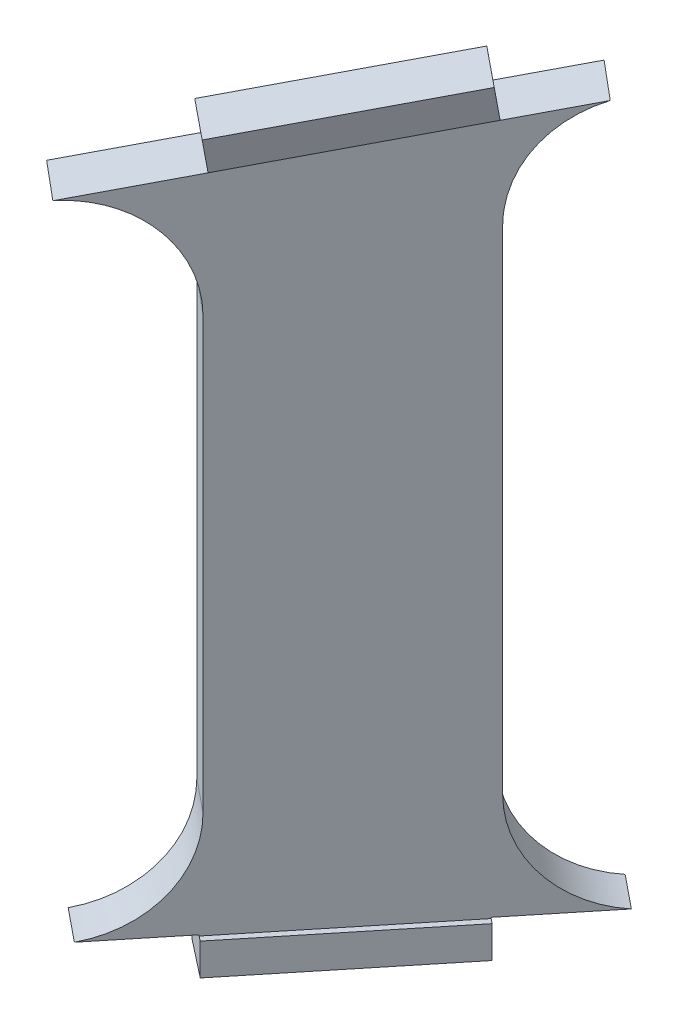
ISO-10303-21;
HEADER;
FILE_DESCRIPTION(('STEP AP214'),'2;1');
FILE_NAME('part.step','',(''),(''),'','','');
FILE_SCHEMA(('AUTOMOTIVE_DESIGN { 1 0 10303 214 1 1 1 1 }'));
ENDSEC;
DATA;
#1=APPLICATION_CONTEXT('core data for automotive mechanical design processes');
#2=APPLICATION_PROTOCOL_DEFINITION('international standard','automotive_design',2000,#1);
#3=PRODUCT_CONTEXT('',#1,'mechanical');
#4=PRODUCT('Part','Part','',(#3));
#5=PRODUCT_RELATED_PRODUCT_CATEGORY('part','',(#4));
#6=PRODUCT_DEFINITION_FORMATION('','',#4);
#7=PRODUCT_DEFINITION_CONTEXT('part definition',#1,'design');
#8=PRODUCT_DEFINITION('design','',#6,#7);
#9=PRODUCT_DEFINITION_SHAPE('','',#8);
#10=(LENGTH_UNIT() NAMED_UNIT(*) SI_UNIT(.MILLI.,.METRE.));
#11=(NAMED_UNIT(*) PLANE_ANGLE_UNIT() SI_UNIT($,.RADIAN.));
#12=(NAMED_UNIT(*) SI_UNIT($,.STERADIAN.) SOLID_ANGLE_UNIT());
#13=UNCERTAINTY_MEASURE_WITH_UNIT(LENGTH_MEASURE(1.E-05),#10,'distance_accuracy_value','');
#14=(GEOMETRIC_REPRESENTATION_CONTEXT(3) GLOBAL_UNCERTAINTY_ASSIGNED_CONTEXT((#13)) GLOBAL_UNIT_ASSIGNED_CONTEXT((#10,
#11,#12)) REPRESENTATION_CONTEXT('',''));
#15=CARTESIAN_POINT('',(0.,0.,0.));
#16=DIRECTION('',(0.,0.,1.));
#17=DIRECTION('',(1.,0.,0.));
#18=AXIS2_PLACEMENT_3D('',#15,#16,#17);
#19=CARTESIAN_POINT('',(87.6889528112121,66.0797360709433,-1.04935465074898));
#20=DIRECTION('',(-0.781529121210514,0.115485382634832,-0.613086746796575));
#21=DIRECTION('',(0.61721643104734,0.,-0.786793414591902));
#22=AXIS2_PLACEMENT_3D('',#19,#20,#21);
#23=PLANE('',#22);
#24=DIRECTION('',(0.623868762401133,0.144670153472484,-0.768022339515152));
#25=VECTOR('',#24,1.);
#26=CARTESIAN_POINT('',(87.6889528112121,69.0278885530628,-0.494019668803317));
#27=LINE('',#26,#25);
#28=CARTESIAN_POINT('',(87.7825331255723,69.0495890760836,-0.609223019730596));
#29=VERTEX_POINT('',#28);
#30=CARTESIAN_POINT('',(100.072747744875,71.8995910994916,-15.7392631081791));
#31=VERTEX_POINT('',#30);
#32=EDGE_CURVE('E175',#29,#31,#27,.T.);
#33=ORIENTED_EDGE('',*,*,#32,.F.);
#34=DIRECTION('',(0.,0.982717494039836,0.185111660648554));
#35=VECTOR('',#34,1.);
#36=CARTESIAN_POINT('',(87.7825331255723,66.1014365939641,-1.16455800167626));
#37=LINE('',#36,#35);
#38=CARTESIAN_POINT('',(87.7825331255723,66.1014365939641,-1.16455800167626));
#39=VERTEX_POINT('',#38);
#40=EDGE_CURVE('E185',#39,#29,#37,.T.);
#41=ORIENTED_EDGE('',*,*,#40,.F.);
#42=DIRECTION('',(0.623868762401133,0.144670153472484,-0.768022339515152));
#43=VECTOR('',#42,1.);
#44=CARTESIAN_POINT('',(87.6889528112121,66.0797360709433,-1.04935465074898));
#45=LINE('',#44,#43);
#46=CARTESIAN_POINT('',(100.072747744875,68.9514386173721,-16.2945980901247));
#47=VERTEX_POINT('',#46);
#48=EDGE_CURVE('E376',#39,#47,#45,.T.);
#49=ORIENTED_EDGE('',*,*,#48,.T.);
#50=DIRECTION('',(0.,0.982717494039836,0.185111660648554));
#51=VECTOR('',#50,1.);
#52=CARTESIAN_POINT('',(100.072747744875,68.9514386173721,-16.2945980901247));
#53=LINE('',#52,#51);
#54=EDGE_CURVE('E187',#47,#31,#53,.T.);
#55=ORIENTED_EDGE('',*,*,#54,.T.);
#56=EDGE_LOOP('',(#33,#41,#49,#55));
#57=FACE_BOUND('',#56,.T.);
#58=ADVANCED_FACE('F34',(#57),#23,.F.);
#59=CARTESIAN_POINT('',(23.2856365374246,56.3073646395534,72.4386164269292));
#60=DIRECTION('',(0.781529121210507,-0.115485382634834,0.613086746796584));
#61=DIRECTION('',(-0.61721643104735,0.,0.786793414591894));
#62=AXIS2_PLACEMENT_3D('',#59,#60,#61);
#63=PLANE('',#62);
#64=DIRECTION('',(-0.623868762401143,-0.144670153472482,0.768022339515144));
#65=VECTOR('',#64,1.);
#66=CARTESIAN_POINT('',(23.2856365374246,55.3246471455136,72.2535047662806));
#67=LINE('',#66,#65);
#68=CARTESIAN_POINT('',(96.8294018920102,72.3788554374026,-18.28357310726));
#69=VERTEX_POINT('',#68);
#70=CARTESIAN_POINT('',(84.5391872727077,69.5288534139947,-3.15353301881178));
#71=VERTEX_POINT('',#70);
#72=EDGE_CURVE('E48',#69,#71,#67,.T.);
#73=ORIENTED_EDGE('',*,*,#72,.F.);
#74=DIRECTION('',(0.,0.982717494039836,0.185111660648554));
#75=VECTOR('',#74,1.);
#76=CARTESIAN_POINT('',(96.8294018920102,69.4307029552831,-18.8389080892057));
#77=LINE('',#76,#75);
#78=CARTESIAN_POINT('',(96.8294018920102,69.4307029552831,-18.8389080892057));
#79=VERTEX_POINT('',#78);
#80=EDGE_CURVE('E194',#79,#69,#77,.T.);
#81=ORIENTED_EDGE('',*,*,#80,.F.);
#82=DIRECTION('',(-0.623868762401143,-0.144670153472503,0.76802233951514));
#83=VECTOR('',#82,1.);
#84=CARTESIAN_POINT('',(45218.3142849364,10532.7405148032,-55566.272071589));
#85=LINE('',#84,#83);
#86=CARTESIAN_POINT('',(84.5391872727077,66.5807009318752,-3.70886800075744));
#87=VERTEX_POINT('',#86);
#88=EDGE_CURVE('E256',#79,#87,#85,.T.);
#89=ORIENTED_EDGE('',*,*,#88,.T.);
#90=DIRECTION('',(0.,0.982717494039836,0.185111660648554));
#91=VECTOR('',#90,1.);
#92=CARTESIAN_POINT('',(84.5391872727077,66.5807009318752,-3.70886800075744));
#93=LINE('',#92,#91);
#94=EDGE_CURVE('E206',#87,#71,#93,.T.);
#95=ORIENTED_EDGE('',*,*,#94,.T.);
#96=EDGE_LOOP('',(#73,#81,#89,#95));
#97=FACE_BOUND('',#96,.T.);
#98=ADVANCED_FACE('F387',(#97),#63,.F.);
#99=CARTESIAN_POINT('',(100.189977113056,68.9341158099769,-16.2026350781053));
#100=DIRECTION('',(-0.623868762401141,-0.144670153472482,0.768022339515146));
#101=DIRECTION('',(-0.776187884580819,0.,-0.630501679482262));
#102=AXIS2_PLACEMENT_3D('',#99,#100,#101);
#103=PLANE('',#102);
#104=DIRECTION('',(-0.781529121210508,0.115485382634833,-0.613086746796583));
#105=VECTOR('',#104,1.);
#106=CARTESIAN_POINT('',(100.189977113056,71.8822682920963,-15.6473000961596));
#107=LINE('',#106,#105);
#108=EDGE_CURVE('E188',#31,#69,#107,.T.);
#109=ORIENTED_EDGE('',*,*,#108,.F.);
#110=ORIENTED_EDGE('',*,*,#54,.F.);
#111=DIRECTION('',(-0.781529121210508,0.115485382634834,-0.613086746796583));
#112=VECTOR('',#111,1.);
#113=CARTESIAN_POINT('',(100.189977113056,68.9341158099769,-16.2026350781053));
#114=LINE('',#113,#112);
#115=CARTESIAN_POINT('',(99.9770303434908,68.9655826337849,-16.3696855931228));
#116=VERTEX_POINT('',#115);
#117=EDGE_CURVE('E289',#47,#116,#114,.T.);
#118=ORIENTED_EDGE('',*,*,#117,.T.);
#119=DIRECTION('',(-0.0912147747353571,0.989479937489512,0.112291220385788));
#120=VECTOR('',#119,1.);
#121=CARTESIAN_POINT('',(-45021.3908201226,489536.690188155,55530.9194033191));
#122=LINE('',#121,#120);
#123=CARTESIAN_POINT('',(99.9862145892339,68.8659537421223,-16.3809919869178));
#124=VERTEX_POINT('',#123);
#125=EDGE_CURVE('E277',#124,#116,#122,.T.);
#126=ORIENTED_EDGE('',*,*,#125,.F.);
#127=DIRECTION('',(0.781529121210507,-0.115485382634835,0.613086746796584));
#128=VECTOR('',#127,1.);
#129=CARTESIAN_POINT('',(96.8294018920102,69.3324312058791,-18.8574192552705));
#130=LINE('',#129,#128);
#131=CARTESIAN_POINT('',(96.8385861377523,69.3310740637012,-18.8502144829965));
#132=VERTEX_POINT('',#131);
#133=EDGE_CURVE('E276',#132,#124,#130,.T.);
#134=ORIENTED_EDGE('',*,*,#133,.F.);
#135=DIRECTION('',(0.0912147747353568,-0.989479937489512,-0.112291220385788));
#136=VECTOR('',#135,1.);
#137=CARTESIAN_POINT('',(104.726730982295,-16.2379698804638,-28.5610251904014));
#138=LINE('',#137,#136);
#139=EDGE_CURVE('E274',#79,#132,#138,.T.);
#140=ORIENTED_EDGE('',*,*,#139,.F.);
#141=ORIENTED_EDGE('',*,*,#80,.T.);
#142=EDGE_LOOP('',(#109,#110,#118,#126,#134,#140,#141));
#143=FACE_BOUND('',#142,.T.);
#144=ADVANCED_FACE('F374',(#143),#103,.F.);
#145=CARTESIAN_POINT('',(84.5391872727077,66.5807009318752,-3.70886800075744));
#146=DIRECTION('',(0.623868762401155,0.14467015347248,-0.768022339515134));
#147=DIRECTION('',(0.776187884580808,0.,0.630501679482276));
#148=AXIS2_PLACEMENT_3D('',#145,#146,#147);
#149=PLANE('',#148);
#150=DIRECTION('',(0.781529121210496,-0.115485382634836,0.613086746796597));
#151=VECTOR('',#150,1.);
#152=CARTESIAN_POINT('',(84.5391872727077,69.5288534139947,-3.15353301881178));
#153=LINE('',#152,#151);
#154=EDGE_CURVE('E11',#71,#29,#153,.T.);
#155=ORIENTED_EDGE('',*,*,#154,.F.);
#156=ORIENTED_EDGE('',*,*,#94,.F.);
#157=DIRECTION('',(-0.0912147747353556,0.989479937489513,0.112291220385787));
#158=VECTOR('',#157,1.);
#159=CARTESIAN_POINT('',(92.4365163629929,-19.0879719038714,-13.4309851019529));
#160=LINE('',#159,#158);
#161=CARTESIAN_POINT('',(84.5483715184498,66.4810720402933,-3.72017439454826));
#162=VERTEX_POINT('',#161);
#163=EDGE_CURVE('E208',#162,#87,#160,.T.);
#164=ORIENTED_EDGE('',*,*,#163,.F.);
#165=DIRECTION('',(-0.781529121210496,0.115485382634836,-0.613086746796597));
#166=VECTOR('',#165,1.);
#167=CARTESIAN_POINT('',(87.7825331255723,66.0031648445602,-1.18306916774111));
#168=LINE('',#167,#166);
#169=CARTESIAN_POINT('',(87.6959999699201,66.015951718793,-1.25095189845959));
#170=VERTEX_POINT('',#169);
#171=EDGE_CURVE('E270',#170,#162,#168,.T.);
#172=ORIENTED_EDGE('',*,*,#171,.F.);
#173=DIRECTION('',(0.0912147747353559,-0.989479937489513,-0.112291220385786));
#174=VECTOR('',#173,1.);
#175=CARTESIAN_POINT('',(-45033.6810347413,489533.840186132,55546.0494434069));
#176=LINE('',#175,#174);
#177=CARTESIAN_POINT('',(87.6868157241857,66.1155806103853,-1.23964550466916));
#178=VERTEX_POINT('',#177);
#179=EDGE_CURVE('E271',#178,#170,#176,.T.);
#180=ORIENTED_EDGE('',*,*,#179,.F.);
#181=DIRECTION('',(0.781529121210496,-0.115485382634836,0.613086746796597));
#182=VECTOR('',#181,1.);
#183=CARTESIAN_POINT('',(84.5391872727077,66.5807009318752,-3.70886800075744));
#184=LINE('',#183,#182);
#185=EDGE_CURVE('E192',#178,#39,#184,.T.);
#186=ORIENTED_EDGE('',*,*,#185,.T.);
#187=ORIENTED_EDGE('',*,*,#40,.T.);
#188=EDGE_LOOP('',(#155,#156,#164,#172,#180,#186,#187));
#189=FACE_BOUND('',#188,.T.);
#190=ADVANCED_FACE('F190',(#189),#149,.F.);
#191=CARTESIAN_POINT('',(87.6897539967065,4.,-0.311520248057614));
#192=DIRECTION('',(0.776187884580825,0.,0.630501679482254));
#193=DIRECTION('',(-0.630501679482254,0.,0.776187884580826));
#194=AXIS2_PLACEMENT_3D('',#191,#192,#193);
#195=PLANE('',#194);
#196=DIRECTION('',(0.,-1.,0.));
#197=VECTOR('',#196,1.);
#198=CARTESIAN_POINT('',(87.7827350313063,3.99999999999999,-0.425985847279171));
#199=LINE('',#198,#197);
#200=CARTESIAN_POINT('',(87.7827350313063,3.99999999999999,-0.425985847279171));
#201=VERTEX_POINT('',#200);
#202=CARTESIAN_POINT('',(87.7827350313063,0.999999999999994,-0.425985847279178));
#203=VERTEX_POINT('',#202);
#204=EDGE_CURVE('E294',#201,#203,#199,.T.);
#205=ORIENTED_EDGE('',*,*,#204,.T.);
#206=DIRECTION('',(0.630501679482254,0.,-0.776187884580826));
#207=VECTOR('',#206,1.);
#208=CARTESIAN_POINT('',(87.6897539967065,0.999999999999987,-0.311520248057612));
#209=LINE('',#208,#207);
#210=CARTESIAN_POINT('',(100.070932441643,0.999999999999994,-15.5535426225011));
#211=VERTEX_POINT('',#210);
#212=EDGE_CURVE('E195',#203,#211,#209,.T.);
#213=ORIENTED_EDGE('',*,*,#212,.T.);
#214=DIRECTION('',(0.,-1.,0.));
#215=VECTOR('',#214,1.);
#216=CARTESIAN_POINT('',(100.070932441643,4.,-15.5535426225011));
#217=LINE('',#216,#215);
#218=CARTESIAN_POINT('',(100.070932441643,4.,-15.5535426225011));
#219=VERTEX_POINT('',#218);
#220=EDGE_CURVE('E290',#219,#211,#217,.T.);
#221=ORIENTED_EDGE('',*,*,#220,.F.);
#222=DIRECTION('',(0.630501679482254,0.,-0.776187884580826));
#223=VECTOR('',#222,1.);
#224=CARTESIAN_POINT('',(87.6897539967065,4.,-0.311520248057614));
#225=LINE('',#224,#223);
#226=EDGE_CURVE('E237',#201,#219,#225,.T.);
#227=ORIENTED_EDGE('',*,*,#226,.F.);
#228=EDGE_LOOP('',(#205,#213,#221,#227));
#229=FACE_BOUND('',#228,.T.);
#230=ADVANCED_FACE('F407',(#229),#195,.T.);
#231=CARTESIAN_POINT('',(72.0356800443528,3.99999999999999,-12.7790901034905));
#232=DIRECTION('',(-0.617216431047363,0.,0.786793414591884));
#233=DIRECTION('',(-0.786793414591884,0.,-0.617216431047363));
#234=AXIS2_PLACEMENT_3D('',#231,#232,#233);
#235=PLANE('',#234);
#236=DIRECTION('',(0.,1.,0.));
#237=VECTOR('',#236,1.);
#238=CARTESIAN_POINT('',(84.1728260475065,4.,-3.25785390573572));
#239=LINE('',#238,#237);
#240=CARTESIAN_POINT('',(84.1728260475065,0.999999999999987,-3.25785390573571));
#241=VERTEX_POINT('',#240);
#242=CARTESIAN_POINT('',(84.1728260475065,4.09999999999998,-3.25785390573572));
#243=VERTEX_POINT('',#242);
#244=EDGE_CURVE('E293',#241,#243,#239,.T.);
#245=ORIENTED_EDGE('',*,*,#244,.F.);
#246=DIRECTION('',(0.786793414591884,0.,0.617216431047363));
#247=VECTOR('',#246,1.);
#248=CARTESIAN_POINT('',(72.0356800443528,0.999999999999994,-12.7790901034905));
#249=LINE('',#248,#247);
#250=EDGE_CURVE('E201',#241,#203,#249,.T.);
#251=ORIENTED_EDGE('',*,*,#250,.T.);
#252=ORIENTED_EDGE('',*,*,#204,.F.);
#253=DIRECTION('',(0.786793414591884,0.,0.617216431047363));
#254=VECTOR('',#253,1.);
#255=CARTESIAN_POINT('',(72.0356800443528,3.99999999999999,-12.7790901034905));
#256=LINE('',#255,#254);
#257=CARTESIAN_POINT('',(87.3204544989858,4.00000000000954,-0.788631409646447));
#258=VERTEX_POINT('',#257);
#259=EDGE_CURVE('E297',#258,#201,#256,.T.);
#260=ORIENTED_EDGE('',*,*,#259,.F.);
#261=DIRECTION('',(0.,-1.,0.));
#262=VECTOR('',#261,1.);
#263=CARTESIAN_POINT('',(87.3204544989857,500000.,-0.788631409646485));
#264=LINE('',#263,#262);
#265=CARTESIAN_POINT('',(87.3204544989858,4.09999999999999,-0.788631409646448));
#266=VERTEX_POINT('',#265);
#267=EDGE_CURVE('E316',#266,#258,#264,.T.);
#268=ORIENTED_EDGE('',*,*,#267,.F.);
#269=DIRECTION('',(0.786793414591884,0.,0.617216431047363));
#270=VECTOR('',#269,1.);
#271=CARTESIAN_POINT('',(84.1728260475065,4.09999999999998,-3.25785390573572));
#272=LINE('',#271,#270);
#273=EDGE_CURVE('E318',#243,#266,#272,.T.);
#274=ORIENTED_EDGE('',*,*,#273,.F.);
#275=EDGE_LOOP('',(#245,#251,#252,#260,#268,#274));
#276=FACE_BOUND('',#275,.T.);
#277=ADVANCED_FACE('F344',(#276),#235,.T.);
#278=CARTESIAN_POINT('',(192.,4.,-136.));
#279=DIRECTION('',(0.776187884580818,0.,0.630501679482264));
#280=DIRECTION('',(-0.630501679482264,0.,0.776187884580818));
#281=AXIS2_PLACEMENT_3D('',#278,#279,#280);
#282=PLANE('',#281);
#283=DIRECTION('',(0.630501679482264,0.,-0.776187884580818));
#284=VECTOR('',#283,1.);
#285=CARTESIAN_POINT('',(192.,0.999999999999987,-136.));
#286=LINE('',#285,#284);
#287=CARTESIAN_POINT('',(96.4610234578431,1.,-18.3854106809575));
#288=VERTEX_POINT('',#287);
#289=EDGE_CURVE('E56',#241,#288,#286,.T.);
#290=ORIENTED_EDGE('',*,*,#289,.F.);
#291=ORIENTED_EDGE('',*,*,#244,.T.);
#292=DIRECTION('',(-0.630501679482264,0.,0.776187884580818));
#293=VECTOR('',#292,1.);
#294=CARTESIAN_POINT('',(192.,4.09999999999999,-136.));
#295=LINE('',#294,#293);
#296=CARTESIAN_POINT('',(78.9636930653886,4.09999999999999,3.15492189084962));
#297=VERTEX_POINT('',#296);
#298=EDGE_CURVE('E310',#243,#297,#295,.T.);
#299=ORIENTED_EDGE('',*,*,#298,.T.);
#300=CARTESIAN_POINT('',(78.0742609927136,14.00000000001,4.24986964663483));
#301=DIRECTION('',(-0.776187884580818,0.,-0.630501679482264));
#302=DIRECTION('',(-0.630501679482264,0.,0.776187884580818));
#303=AXIS2_PLACEMENT_3D('',#300,#301,#302);
#304=CIRCLE('',#303,10.);
#305=CARTESIAN_POINT('',(84.3792777875361,14.00000000001,-3.51200919917349));
#306=VERTEX_POINT('',#305);
#307=EDGE_CURVE('E223',#306,#297,#304,.T.);
#308=ORIENTED_EDGE('',*,*,#307,.F.);
#309=DIRECTION('',(0.,-1.,0.));
#310=VECTOR('',#309,1.);
#311=CARTESIAN_POINT('',(84.379277787536,500000.,-3.51200919917357));
#312=LINE('',#311,#310);
#313=CARTESIAN_POINT('',(84.3792777875361,54.9056720327599,-3.51200919917349));
#314=VERTEX_POINT('',#313);
#315=EDGE_CURVE('E220',#314,#306,#312,.T.);
#316=ORIENTED_EDGE('',*,*,#315,.F.);
#317=CARTESIAN_POINT('',(78.0742609927137,54.9056720327663,4.24986964663483));
#318=DIRECTION('',(-0.776187884580818,0.,-0.630501679482264));
#319=DIRECTION('',(0.,-1.,0.));
#320=AXIS2_PLACEMENT_3D('',#317,#318,#319);
#321=ELLIPSE('',#320,10.0702795953244,10.);
#322=CARTESIAN_POINT('',(78.0576096315716,64.9759165093224,4.27036853696438));
#323=VERTEX_POINT('',#322);
#324=EDGE_CURVE('E224',#323,#314,#321,.T.);
#325=ORIENTED_EDGE('',*,*,#324,.F.);
#326=DIRECTION('',(0.623868762401143,0.144670153472482,-0.768022339515144));
#327=VECTOR('',#326,1.);
#328=CARTESIAN_POINT('',(184.111855155457,89.5690439441649,-126.289189292595));
#329=LINE('',#328,#327);
#330=EDGE_CURVE('E207',#323,#162,#329,.T.);
#331=ORIENTED_EDGE('',*,*,#330,.T.);
#332=ORIENTED_EDGE('',*,*,#163,.T.);
#333=ORIENTED_EDGE('',*,*,#88,.F.);
#334=ORIENTED_EDGE('',*,*,#139,.T.);
#335=CARTESIAN_POINT('',(101.51727017257,70.4160233000778,-24.6099737061431));
#336=VERTEX_POINT('',#335);
#337=EDGE_CURVE('E198',#132,#336,#329,.T.);
#338=ORIENTED_EDGE('',*,*,#337,.T.);
#339=CARTESIAN_POINT('',(103.294328172004,60.7540029787999,-26.7976457365979));
#340=DIRECTION('',(-0.776187884580818,0.,-0.630501679482264));
#341=DIRECTION('',(0.,1.,0.));
#342=AXIS2_PLACEMENT_3D('',#339,#340,#341);
#343=ELLIPSE('',#342,10.0702795953244,10.);
#344=CARTESIAN_POINT('',(96.9893113771814,60.754002978797,-19.0357668907898));
#345=VERTEX_POINT('',#344);
#346=EDGE_CURVE('E251',#345,#336,#343,.T.);
#347=ORIENTED_EDGE('',*,*,#346,.F.);
#348=DIRECTION('',(0.,-1.,0.));
#349=VECTOR('',#348,1.);
#350=CARTESIAN_POINT('',(96.9893113771813,500000.,-19.0357668907899));
#351=LINE('',#350,#349);
#352=CARTESIAN_POINT('',(96.9893113771814,14.00000000001,-19.0357668907898));
#353=VERTEX_POINT('',#352);
#354=EDGE_CURVE('E225',#345,#353,#351,.T.);
#355=ORIENTED_EDGE('',*,*,#354,.T.);
#356=CARTESIAN_POINT('',(103.294328172004,14.00000000001,-26.7976457365979));
#357=DIRECTION('',(-0.776187884580818,0.,-0.630501679482264));
#358=DIRECTION('',(-0.630501679482264,0.,0.776187884580818));
#359=AXIS2_PLACEMENT_3D('',#356,#357,#358);
#360=CIRCLE('',#359,10.);
#361=CARTESIAN_POINT('',(102.404896099329,4.09999999999999,-25.7026979808127));
#362=VERTEX_POINT('',#361);
#363=EDGE_CURVE('E249',#362,#353,#360,.T.);
#364=ORIENTED_EDGE('',*,*,#363,.F.);
#365=CARTESIAN_POINT('',(96.4610234578431,4.09999999999999,-18.3854106809574));
#366=VERTEX_POINT('',#365);
#367=EDGE_CURVE('E314',#362,#366,#295,.T.);
#368=ORIENTED_EDGE('',*,*,#367,.T.);
#369=DIRECTION('',(0.,-1.,0.));
#370=VECTOR('',#369,1.);
#371=CARTESIAN_POINT('',(96.4610234578431,4.,-18.3854106809575));
#372=LINE('',#371,#370);
#373=EDGE_CURVE('E242',#366,#288,#372,.T.);
#374=ORIENTED_EDGE('',*,*,#373,.T.);
#375=EDGE_LOOP('',(#290,#291,#299,#308,#316,#325,#331,#332,#333,#334,#338,#347,#355,#364,#368,#374));
#376=FACE_BOUND('',#375,.T.);
#377=ADVANCED_FACE('F390',(#376),#282,.F.);
#378=CARTESIAN_POINT('',(100.190974962759,4.,-15.4593727742495));
#379=DIRECTION('',(0.617216431047349,0.,-0.786793414591894));
#380=DIRECTION('',(0.786793414591894,0.,0.617216431047349));
#381=AXIS2_PLACEMENT_3D('',#378,#379,#380);
#382=PLANE('',#381);
#383=ORIENTED_EDGE('',*,*,#220,.T.);
#384=DIRECTION('',(-0.786793414591895,0.,-0.617216431047349));
#385=VECTOR('',#384,1.);
#386=CARTESIAN_POINT('',(100.190974962759,0.999999999999994,-15.4593727742495));
#387=LINE('',#386,#385);
#388=EDGE_CURVE('E42',#211,#288,#387,.T.);
#389=ORIENTED_EDGE('',*,*,#388,.T.);
#390=ORIENTED_EDGE('',*,*,#373,.F.);
#391=DIRECTION('',(-0.786793414591895,0.,-0.617216431047348));
#392=VECTOR('',#391,1.);
#393=CARTESIAN_POINT('',(100.070932441643,4.09999999999999,-15.5535426225011));
#394=LINE('',#393,#392);
#395=CARTESIAN_POINT('',(99.6086519093224,4.09999999999999,-15.9161881848682));
#396=VERTEX_POINT('',#395);
#397=EDGE_CURVE('E321',#396,#366,#394,.T.);
#398=ORIENTED_EDGE('',*,*,#397,.F.);
#399=DIRECTION('',(0.,1.,0.));
#400=VECTOR('',#399,1.);
#401=CARTESIAN_POINT('',(99.6086519093223,500000.,-15.9161881848683));
#402=LINE('',#401,#400);
#403=CARTESIAN_POINT('',(99.6086519093224,4.,-15.9161881848682));
#404=VERTEX_POINT('',#403);
#405=EDGE_CURVE('E305',#404,#396,#402,.T.);
#406=ORIENTED_EDGE('',*,*,#405,.F.);
#407=DIRECTION('',(-0.786793414591894,0.,-0.617216431047349));
#408=VECTOR('',#407,1.);
#409=CARTESIAN_POINT('',(100.190974962759,4.,-15.4593727742495));
#410=LINE('',#409,#408);
#411=EDGE_CURVE('E302',#219,#404,#410,.T.);
#412=ORIENTED_EDGE('',*,*,#411,.F.);
#413=EDGE_LOOP('',(#383,#389,#390,#398,#406,#412));
#414=FACE_BOUND('',#413,.T.);
#415=ADVANCED_FACE('F408',(#414),#382,.T.);
#416=CARTESIAN_POINT('',(190.263416524578,47.4467199030883,43.8478221438401));
#417=DIRECTION('',(-0.770770937622428,0.117936927335513,-0.626101463731958));
#418=DIRECTION('',(0.630501679482265,0.,-0.776187884580817));
#419=AXIS2_PLACEMENT_3D('',#416,#417,#418);
#420=CYLINDRICAL_SURFACE('',#419,10.);
#421=DIRECTION('',(-0.770770937622428,0.117936927335513,-0.626101463731958));
#422=VECTOR('',#421,1.);
#423=CARTESIAN_POINT('',(189.364658936674,56.974350035586,46.7489424199586));
#424=LINE('',#423,#422);
#425=CARTESIAN_POINT('',(104.622021710893,69.940960166925,-22.0879669882141));
#426=VERTEX_POINT('',#425);
#427=EDGE_CURVE('E260',#336,#426,#424,.F.);
#428=ORIENTED_EDGE('',*,*,#427,.T.);
#429=CARTESIAN_POINT('',(106.399079710327,60.278939845647,-24.2756390186689));
#430=DIRECTION('',(0.776187884580816,0.,0.630501679482265));
#431=DIRECTION('',(0.,1.,0.));
#432=AXIS2_PLACEMENT_3D('',#429,#430,#431);
#433=ELLIPSE('',#432,10.0702795953244,10.);
#434=CARTESIAN_POINT('',(100.094062915505,60.2789398456594,-16.5137601728608));
#435=VERTEX_POINT('',#434);
#436=EDGE_CURVE('E214',#426,#435,#433,.T.);
#437=ORIENTED_EDGE('',*,*,#436,.T.);
#438=DIRECTION('',(0.770770937622429,-0.117936927335513,0.626101463731958));
#439=VECTOR('',#438,1.);
#440=CARTESIAN_POINT('',(96.1972080903185,60.875204003936,-19.6791967389125));
#441=LINE('',#440,#439);
#442=EDGE_CURVE('E234',#435,#345,#441,.F.);
#443=ORIENTED_EDGE('',*,*,#442,.T.);
#444=ORIENTED_EDGE('',*,*,#346,.T.);
#445=EDGE_LOOP('',(#428,#437,#443,#444));
#446=FACE_BOUND('',#445,.T.);
#447=ADVANCED_FACE('F366',(#446),#420,.F.);
#448=CARTESIAN_POINT('',(99.9943656155856,35.6903819791565,159.740893755476));
#449=DIRECTION('',(0.,0.982717494039836,0.185111660648554));
#450=DIRECTION('',(0.,-0.185111660648554,0.982717494039836));
#451=AXIS2_PLACEMENT_3D('',#448,#449,#450);
#452=PLANE('',#451);
#453=ORIENTED_EDGE('',*,*,#337,.F.);
#454=ORIENTED_EDGE('',*,*,#133,.T.);
#455=DIRECTION('',(-0.623868762401144,-0.144670153472482,0.768022339515143));
#456=VECTOR('',#455,1.);
#457=CARTESIAN_POINT('',(45221.4710976272,10532.175765587,-55563.8141554788));
#458=LINE('',#457,#456);
#459=EDGE_CURVE('E263',#426,#124,#458,.T.);
#460=ORIENTED_EDGE('',*,*,#459,.F.);
#461=ORIENTED_EDGE('',*,*,#427,.F.);
#462=EDGE_LOOP('',(#453,#454,#460,#461));
#463=FACE_BOUND('',#462,.T.);
#464=ADVANCED_FACE('F370',(#463),#452,.T.);
#465=CARTESIAN_POINT('',(99.9943656155856,37.0585128444138,153.017999416653));
#466=DIRECTION('',(0.,0.982717494039836,0.185111660648554));
#467=DIRECTION('',(0.,-0.185111660648554,0.982717494039836));
#468=AXIS2_PLACEMENT_3D('',#465,#466,#467);
#469=PLANE('',#468);
#470=ORIENTED_EDGE('',*,*,#48,.F.);
#471=ORIENTED_EDGE('',*,*,#185,.F.);
#472=DIRECTION('',(-0.623868762401145,-0.144670153472482,0.768022339515143));
#473=VECTOR('',#472,1.);
#474=CARTESIAN_POINT('',(45221.4619133815,10532.2753944785,-55563.802849085));
#475=LINE('',#474,#473);
#476=EDGE_CURVE('E286',#116,#178,#475,.T.);
#477=ORIENTED_EDGE('',*,*,#476,.F.);
#478=ORIENTED_EDGE('',*,*,#117,.F.);
#479=EDGE_LOOP('',(#470,#471,#477,#478));
#480=FACE_BOUND('',#479,.T.);
#481=ADVANCED_FACE('F446',(#480),#469,.F.);
#482=ORIENTED_EDGE('',*,*,#330,.F.);
#483=DIRECTION('',(0.770770937622428,-0.117936927335513,0.626101463731958));
#484=VECTOR('',#483,1.);
#485=CARTESIAN_POINT('',(165.410479871163,51.6099103366276,75.2275845509745));
#486=LINE('',#485,#484);
#487=CARTESIAN_POINT('',(81.1623611698946,64.5008533761696,6.79237525489328));
#488=VERTEX_POINT('',#487);
#489=EDGE_CURVE('E219',#488,#323,#486,.F.);
#490=ORIENTED_EDGE('',*,*,#489,.F.);
#491=EDGE_CURVE('E264',#170,#488,#458,.T.);
#492=ORIENTED_EDGE('',*,*,#491,.F.);
#493=ORIENTED_EDGE('',*,*,#171,.T.);
#494=EDGE_LOOP('',(#482,#490,#492,#493));
#495=FACE_BOUND('',#494,.T.);
#496=ADVANCED_FACE('F395',(#495),#452,.T.);
#497=CARTESIAN_POINT('',(164.511722283259,41.6797340871364,74.4634939462516));
#498=DIRECTION('',(0.770770937622428,-0.117936927335513,0.626101463731958));
#499=DIRECTION('',(-0.630501679482265,0.,0.776187884580817));
#500=AXIS2_PLACEMENT_3D('',#497,#498,#499);
#501=CYLINDRICAL_SURFACE('',#500,10.);
#502=ORIENTED_EDGE('',*,*,#489,.T.);
#503=ORIENTED_EDGE('',*,*,#324,.T.);
#504=DIRECTION('',(-0.770770937622429,0.117936927335513,-0.626101463731958));
#505=VECTOR('',#504,1.);
#506=CARTESIAN_POINT('',(86.4261125079819,54.5924824897905,-1.84935411977785));
#507=LINE('',#506,#505);
#508=CARTESIAN_POINT('',(87.4840293258594,54.4306088996223,-0.990002481244435));
#509=VERTEX_POINT('',#508);
#510=EDGE_CURVE('E229',#314,#509,#507,.F.);
#511=ORIENTED_EDGE('',*,*,#510,.T.);
#512=CARTESIAN_POINT('',(81.1790125310367,54.4306088996135,6.77187636456372));
#513=DIRECTION('',(0.776187884580816,0.,0.630501679482265));
#514=DIRECTION('',(0.,-1.,0.));
#515=AXIS2_PLACEMENT_3D('',#512,#513,#514);
#516=ELLIPSE('',#515,10.0702795953244,10.);
#517=EDGE_CURVE('E245',#509,#488,#516,.T.);
#518=ORIENTED_EDGE('',*,*,#517,.T.);
#519=EDGE_LOOP('',(#502,#503,#511,#518));
#520=FACE_BOUND('',#519,.T.);
#521=ADVANCED_FACE('F400',(#520),#501,.F.);
#522=CARTESIAN_POINT('',(84.379277787536,500000.,-3.51200919917357));
#523=DIRECTION('',(0.630501679482265,0.,-0.776187884580817));
#524=DIRECTION('',(0.776187884580817,0.,0.630501679482265));
#525=AXIS2_PLACEMENT_3D('',#522,#523,#524);
#526=PLANE('',#525);
#527=DIRECTION('',(0.,-1.,0.));
#528=VECTOR('',#527,1.);
#529=CARTESIAN_POINT('',(87.4840293258593,500000.,-0.990002481244524));
#530=LINE('',#529,#528);
#531=CARTESIAN_POINT('',(87.4840293258594,14.00000000001,-0.990002481244433));
#532=VERTEX_POINT('',#531);
#533=EDGE_CURVE('E215',#509,#532,#530,.T.);
#534=ORIENTED_EDGE('',*,*,#533,.F.);
#535=ORIENTED_EDGE('',*,*,#510,.F.);
#536=ORIENTED_EDGE('',*,*,#315,.T.);
#537=DIRECTION('',(-0.776187884580817,0.,-0.630501679482265));
#538=VECTOR('',#537,1.);
#539=CARTESIAN_POINT('',(84.3792777875361,14.00000000001,-3.51200919917349));
#540=LINE('',#539,#538);
#541=EDGE_CURVE('E218',#532,#306,#540,.T.);
#542=ORIENTED_EDGE('',*,*,#541,.F.);
#543=EDGE_LOOP('',(#534,#535,#536,#542));
#544=FACE_BOUND('',#543,.T.);
#545=ADVANCED_FACE('F402',(#544),#526,.F.);
#546=CARTESIAN_POINT('',(96.9893113771813,500000.,-19.0357668907899));
#547=DIRECTION('',(-0.630501679482265,0.,0.776187884580817));
#548=DIRECTION('',(-0.776187884580817,0.,-0.630501679482265));
#549=AXIS2_PLACEMENT_3D('',#546,#547,#548);
#550=PLANE('',#549);
#551=ORIENTED_EDGE('',*,*,#354,.F.);
#552=ORIENTED_EDGE('',*,*,#442,.F.);
#553=DIRECTION('',(0.,-1.,0.));
#554=VECTOR('',#553,1.);
#555=CARTESIAN_POINT('',(100.094062915505,500000.,-16.5137601728608));
#556=LINE('',#555,#554);
#557=CARTESIAN_POINT('',(100.094062915505,14.00000000001,-16.5137601728608));
#558=VERTEX_POINT('',#557);
#559=EDGE_CURVE('E210',#435,#558,#556,.T.);
#560=ORIENTED_EDGE('',*,*,#559,.T.);
#561=DIRECTION('',(0.776187884580817,0.,0.630501679482265));
#562=VECTOR('',#561,1.);
#563=CARTESIAN_POINT('',(96.9893113771814,14.00000000001,-19.0357668907898));
#564=LINE('',#563,#562);
#565=EDGE_CURVE('E228',#353,#558,#564,.T.);
#566=ORIENTED_EDGE('',*,*,#565,.F.);
#567=EDGE_LOOP('',(#551,#552,#560,#566));
#568=FACE_BOUND('',#567,.T.);
#569=ADVANCED_FACE('F363',(#568),#550,.F.);
#570=CARTESIAN_POINT('',(0.,3.99999999999999,52.783119399867));
#571=DIRECTION('',(0.,1.,0.));
#572=DIRECTION('',(0.,0.,1.));
#573=AXIS2_PLACEMENT_3D('',#570,#571,#572);
#574=PLANE('',#573);
#575=ORIENTED_EDGE('',*,*,#226,.T.);
#576=ORIENTED_EDGE('',*,*,#411,.T.);
#577=DIRECTION('',(-0.630501679482266,0.,0.776187884580816));
#578=VECTOR('',#577,1.);
#579=CARTESIAN_POINT('',(100.094062915505,4.,-16.5137601728608));
#580=LINE('',#579,#578);
#581=EDGE_CURVE('E246',#404,#258,#580,.T.);
#582=ORIENTED_EDGE('',*,*,#581,.T.);
#583=ORIENTED_EDGE('',*,*,#259,.T.);
#584=EDGE_LOOP('',(#575,#576,#582,#583));
#585=FACE_BOUND('',#584,.T.);
#586=ADVANCED_FACE('F348',(#585),#574,.T.);
#587=CARTESIAN_POINT('',(103.294328172004,14.00000000001,-26.797645736598));
#588=DIRECTION('',(0.776187884580817,0.,0.630501679482265));
#589=DIRECTION('',(-0.630501679482265,0.,0.776187884580817));
#590=AXIS2_PLACEMENT_3D('',#587,#588,#589);
#591=CYLINDRICAL_SURFACE('',#590,10.);
#592=DIRECTION('',(0.776187884580817,0.,0.630501679482265));
#593=VECTOR('',#592,1.);
#594=CARTESIAN_POINT('',(102.404896099329,4.09999999999999,-25.7026979808128));
#595=LINE('',#594,#593);
#596=CARTESIAN_POINT('',(105.509647637652,4.09999999999999,-23.1806912628837));
#597=VERTEX_POINT('',#596);
#598=EDGE_CURVE('E313',#597,#362,#595,.F.);
#599=ORIENTED_EDGE('',*,*,#598,.T.);
#600=ORIENTED_EDGE('',*,*,#363,.T.);
#601=ORIENTED_EDGE('',*,*,#565,.T.);
#602=CARTESIAN_POINT('',(106.399079710327,14.00000000001,-24.2756390186689));
#603=DIRECTION('',(0.776187884580816,0.,0.630501679482265));
#604=DIRECTION('',(0.630501679482266,0.,-0.776187884580816));
#605=AXIS2_PLACEMENT_3D('',#602,#603,#604);
#606=CIRCLE('',#605,10.);
#607=EDGE_CURVE('E213',#558,#597,#606,.T.);
#608=ORIENTED_EDGE('',*,*,#607,.T.);
#609=EDGE_LOOP('',(#599,#600,#601,#608));
#610=FACE_BOUND('',#609,.T.);
#611=ADVANCED_FACE('F357',(#610),#591,.F.);
#612=CARTESIAN_POINT('',(78.0742609927135,14.00000000001,4.24986964663468));
#613=DIRECTION('',(-0.776187884580817,0.,-0.630501679482265));
#614=DIRECTION('',(0.630501679482265,0.,-0.776187884580817));
#615=AXIS2_PLACEMENT_3D('',#612,#613,#614);
#616=CYLINDRICAL_SURFACE('',#615,10.);
#617=DIRECTION('',(-0.776187884580817,0.,-0.630501679482265));
#618=VECTOR('',#617,1.);
#619=CARTESIAN_POINT('',(78.9636930653884,4.09999999999999,3.15492189084948));
#620=LINE('',#619,#618);
#621=CARTESIAN_POINT('',(82.0684446037117,4.09999999999999,5.67692860877852));
#622=VERTEX_POINT('',#621);
#623=EDGE_CURVE('E306',#297,#622,#620,.F.);
#624=ORIENTED_EDGE('',*,*,#623,.T.);
#625=CARTESIAN_POINT('',(81.1790125310367,14.00000000001,6.77187636456373));
#626=DIRECTION('',(0.776187884580816,0.,0.630501679482265));
#627=DIRECTION('',(0.630501679482266,0.,-0.776187884580816));
#628=AXIS2_PLACEMENT_3D('',#625,#626,#627);
#629=CIRCLE('',#628,10.);
#630=EDGE_CURVE('E243',#622,#532,#629,.T.);
#631=ORIENTED_EDGE('',*,*,#630,.T.);
#632=ORIENTED_EDGE('',*,*,#541,.T.);
#633=ORIENTED_EDGE('',*,*,#307,.T.);
#634=EDGE_LOOP('',(#624,#631,#632,#633));
#635=FACE_BOUND('',#634,.T.);
#636=ADVANCED_FACE('F405',(#635),#616,.F.);
#637=CARTESIAN_POINT('',(100.094062915505,500000.,-16.5137601728608));
#638=DIRECTION('',(-0.776187884580816,0.,-0.630501679482265));
#639=DIRECTION('',(0.630501679482266,0.,-0.776187884580816));
#640=AXIS2_PLACEMENT_3D('',#637,#638,#639);
#641=PLANE('',#640);
#642=DIRECTION('',(0.630501679482266,0.,-0.776187884580816));
#643=VECTOR('',#642,1.);
#644=CARTESIAN_POINT('',(100.094062915505,4.09999999999398,-16.5137601728608));
#645=LINE('',#644,#643);
#646=EDGE_CURVE('E311',#396,#597,#645,.T.);
#647=ORIENTED_EDGE('',*,*,#646,.T.);
#648=ORIENTED_EDGE('',*,*,#607,.F.);
#649=ORIENTED_EDGE('',*,*,#559,.F.);
#650=ORIENTED_EDGE('',*,*,#436,.F.);
#651=ORIENTED_EDGE('',*,*,#459,.T.);
#652=ORIENTED_EDGE('',*,*,#125,.T.);
#653=ORIENTED_EDGE('',*,*,#476,.T.);
#654=ORIENTED_EDGE('',*,*,#179,.T.);
#655=ORIENTED_EDGE('',*,*,#491,.T.);
#656=ORIENTED_EDGE('',*,*,#517,.F.);
#657=ORIENTED_EDGE('',*,*,#533,.T.);
#658=ORIENTED_EDGE('',*,*,#630,.F.);
#659=EDGE_CURVE('E309',#622,#266,#645,.T.);
#660=ORIENTED_EDGE('',*,*,#659,.T.);
#661=ORIENTED_EDGE('',*,*,#267,.T.);
#662=ORIENTED_EDGE('',*,*,#581,.F.);
#663=ORIENTED_EDGE('',*,*,#405,.T.);
#664=EDGE_LOOP('',(#647,#648,#649,#650,#651,#652,#653,#654,#655,#656,#657,#658,#660,#661,#662,#663));
#665=FACE_BOUND('',#664,.T.);
#666=ADVANCED_FACE('F334',(#665),#641,.F.);
#667=CARTESIAN_POINT('',(99.9943656155856,4.09999999999999,159.759404921541));
#668=DIRECTION('',(0.,-1.,0.));
#669=DIRECTION('',(0.,0.,-1.));
#670=AXIS2_PLACEMENT_3D('',#667,#668,#669);
#671=PLANE('',#670);
#672=ORIENTED_EDGE('',*,*,#367,.F.);
#673=ORIENTED_EDGE('',*,*,#598,.F.);
#674=ORIENTED_EDGE('',*,*,#646,.F.);
#675=ORIENTED_EDGE('',*,*,#397,.T.);
#676=EDGE_LOOP('',(#672,#673,#674,#675));
#677=FACE_BOUND('',#676,.T.);
#678=ADVANCED_FACE('F36',(#677),#671,.T.);
#679=ORIENTED_EDGE('',*,*,#298,.F.);
#680=ORIENTED_EDGE('',*,*,#273,.T.);
#681=ORIENTED_EDGE('',*,*,#659,.F.);
#682=ORIENTED_EDGE('',*,*,#623,.F.);
#683=EDGE_LOOP('',(#679,#680,#681,#682));
#684=FACE_BOUND('',#683,.T.);
#685=ADVANCED_FACE('F341',(#684),#671,.T.);
#686=CARTESIAN_POINT('',(0.,0.999999999999994,0.));
#687=DIRECTION('',(0.,-1.,0.));
#688=DIRECTION('',(0.,0.,-1.));
#689=AXIS2_PLACEMENT_3D('',#686,#687,#688);
#690=PLANE('',#689);
#691=ORIENTED_EDGE('',*,*,#250,.F.);
#692=ORIENTED_EDGE('',*,*,#289,.T.);
#693=ORIENTED_EDGE('',*,*,#388,.F.);
#694=ORIENTED_EDGE('',*,*,#212,.F.);
#695=EDGE_LOOP('',(#691,#692,#693,#694));
#696=FACE_BOUND('',#695,.T.);
#697=ADVANCED_FACE('F426',(#696),#690,.T.);
#698=CARTESIAN_POINT('',(0.,66.572688021298,12.5401052776629));
#699=DIRECTION('',(0.,0.982717494039836,0.185111660648554));
#700=DIRECTION('',(0.,-0.185111660648554,0.982717494039836));
#701=AXIS2_PLACEMENT_3D('',#698,#699,#700);
#702=PLANE('',#701);
#703=ORIENTED_EDGE('',*,*,#108,.T.);
#704=ORIENTED_EDGE('',*,*,#72,.T.);
#705=ORIENTED_EDGE('',*,*,#154,.T.);
#706=ORIENTED_EDGE('',*,*,#32,.T.);
#707=EDGE_LOOP('',(#703,#704,#705,#706));
#708=FACE_BOUND('',#707,.T.);
#709=ADVANCED_FACE('F174',(#708),#702,.T.);
#710=CLOSED_SHELL('',(#58,#98,#144,#190,#230,#277,#377,#415,#447,#464,#481,#496,#521,#545,#569,
#586,#611,#636,#666,#678,#685,#697,#709));
#711=MANIFOLD_SOLID_BREP('B2',#710);
#712=ADVANCED_BREP_SHAPE_REPRESENTATION('',(#18,#711),#14);
#713=SHAPE_DEFINITION_REPRESENTATION(#9,#712);
ENDSEC;
END-ISO-10303-21;
